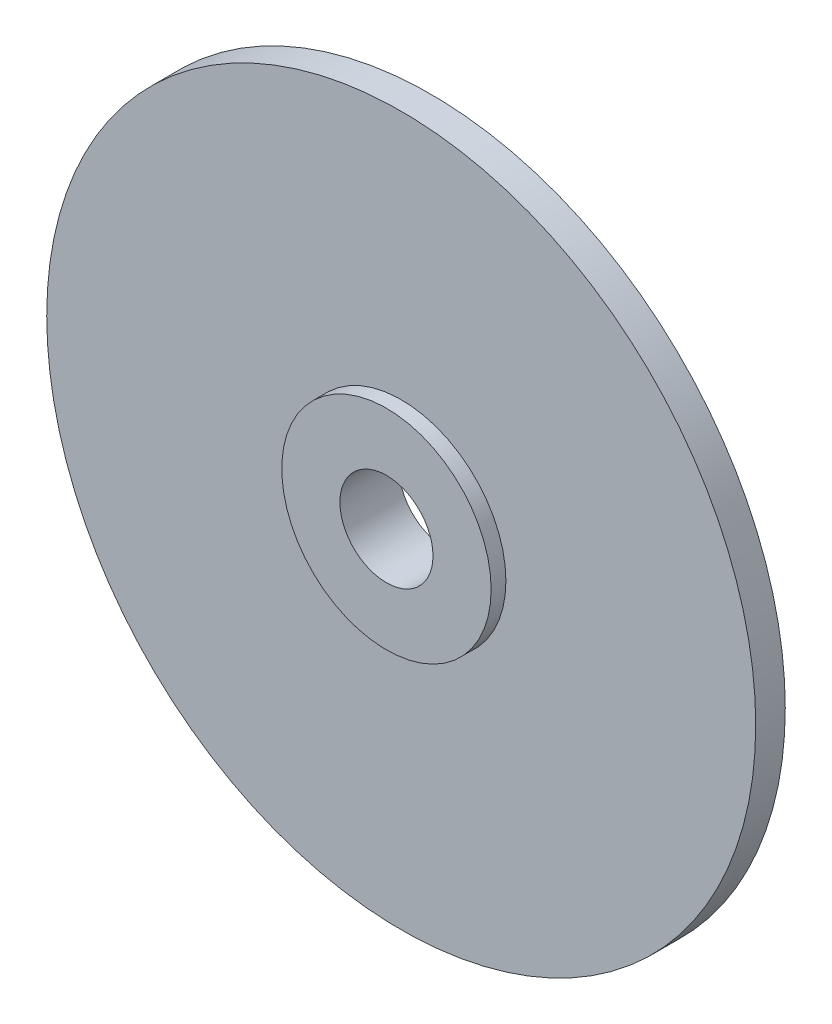
ISO-10303-21;
HEADER;
FILE_DESCRIPTION(('STEP AP214'),'2;1');
FILE_NAME('part.step','',(''),(''),'','','');
FILE_SCHEMA(('AUTOMOTIVE_DESIGN { 1 0 10303 214 1 1 1 1 }'));
ENDSEC;
DATA;
#1=APPLICATION_CONTEXT('core data for automotive mechanical design processes');
#2=APPLICATION_PROTOCOL_DEFINITION('international standard','automotive_design',2000,#1);
#3=PRODUCT_CONTEXT('',#1,'mechanical');
#4=PRODUCT('Part','Part','',(#3));
#5=PRODUCT_RELATED_PRODUCT_CATEGORY('part','',(#4));
#6=PRODUCT_DEFINITION_FORMATION('','',#4);
#7=PRODUCT_DEFINITION_CONTEXT('part definition',#1,'design');
#8=PRODUCT_DEFINITION('design','',#6,#7);
#9=PRODUCT_DEFINITION_SHAPE('','',#8);
#10=(LENGTH_UNIT() NAMED_UNIT(*) SI_UNIT(.MILLI.,.METRE.));
#11=(NAMED_UNIT(*) PLANE_ANGLE_UNIT() SI_UNIT($,.RADIAN.));
#12=(NAMED_UNIT(*) SI_UNIT($,.STERADIAN.) SOLID_ANGLE_UNIT());
#13=UNCERTAINTY_MEASURE_WITH_UNIT(LENGTH_MEASURE(1.E-05),#10,'distance_accuracy_value','');
#14=(GEOMETRIC_REPRESENTATION_CONTEXT(3) GLOBAL_UNCERTAINTY_ASSIGNED_CONTEXT((#13)) GLOBAL_UNIT_ASSIGNED_CONTEXT((#10,
#11,#12)) REPRESENTATION_CONTEXT('',''));
#15=CARTESIAN_POINT('',(0.,0.,0.));
#16=DIRECTION('',(0.,0.,1.));
#17=DIRECTION('',(1.,0.,0.));
#18=AXIS2_PLACEMENT_3D('',#15,#16,#17);
#19=CARTESIAN_POINT('',(0.,0.,0.));
#20=DIRECTION('',(0.,0.,1.));
#21=DIRECTION('',(1.,0.,0.));
#22=AXIS2_PLACEMENT_3D('',#19,#20,#21);
#23=PLANE('',#22);
#24=CARTESIAN_POINT('',(0.,0.,0.));
#25=DIRECTION('',(0.,0.,1.));
#26=DIRECTION('',(1.,0.,0.));
#27=AXIS2_PLACEMENT_3D('',#24,#25,#26);
#28=CIRCLE('',#27,152.4);
#29=CARTESIAN_POINT('',(152.4,0.,0.));
#30=VERTEX_POINT('',#29);
#31=EDGE_CURVE('E42',#30,#30,#28,.T.);
#32=ORIENTED_EDGE('',*,*,#31,.F.);
#33=EDGE_LOOP('',(#32));
#34=FACE_BOUND('',#33,.T.);
#35=CARTESIAN_POINT('',(0.,0.,0.));
#36=DIRECTION('',(0.,0.,1.));
#37=DIRECTION('',(1.,0.,0.));
#38=AXIS2_PLACEMENT_3D('',#35,#36,#37);
#39=CIRCLE('',#38,45.);
#40=CARTESIAN_POINT('',(45.,0.,0.));
#41=VERTEX_POINT('',#40);
#42=EDGE_CURVE('E10',#41,#41,#39,.F.);
#43=ORIENTED_EDGE('',*,*,#42,.F.);
#44=EDGE_LOOP('',(#43));
#45=FACE_BOUND('',#44,.T.);
#46=ADVANCED_FACE('F31',(#34,#45),#23,.F.);
#47=CARTESIAN_POINT('',(0.,0.,12.7));
#48=DIRECTION('',(0.,0.,1.));
#49=DIRECTION('',(1.,0.,0.));
#50=AXIS2_PLACEMENT_3D('',#47,#48,#49);
#51=PLANE('',#50);
#52=CARTESIAN_POINT('',(0.,0.,12.7));
#53=DIRECTION('',(0.,0.,1.));
#54=DIRECTION('',(1.,0.,0.));
#55=AXIS2_PLACEMENT_3D('',#52,#53,#54);
#56=CIRCLE('',#55,152.4);
#57=CARTESIAN_POINT('',(152.4,0.,12.7));
#58=VERTEX_POINT('',#57);
#59=EDGE_CURVE('E38',#58,#58,#56,.T.);
#60=ORIENTED_EDGE('',*,*,#59,.T.);
#61=EDGE_LOOP('',(#60));
#62=FACE_BOUND('',#61,.T.);
#63=CARTESIAN_POINT('',(0.,0.,12.7));
#64=DIRECTION('',(0.,0.,1.));
#65=DIRECTION('',(1.,0.,0.));
#66=AXIS2_PLACEMENT_3D('',#63,#64,#65);
#67=CIRCLE('',#66,45.);
#68=CARTESIAN_POINT('',(45.,0.,12.7));
#69=VERTEX_POINT('',#68);
#70=EDGE_CURVE('E49',#69,#69,#67,.T.);
#71=ORIENTED_EDGE('',*,*,#70,.F.);
#72=EDGE_LOOP('',(#71));
#73=FACE_BOUND('',#72,.T.);
#74=ADVANCED_FACE('F82',(#62,#73),#51,.T.);
#75=CARTESIAN_POINT('',(0.,0.,12.7));
#76=DIRECTION('',(0.,0.,-1.));
#77=DIRECTION('',(-1.,0.,0.));
#78=AXIS2_PLACEMENT_3D('',#75,#76,#77);
#79=CYLINDRICAL_SURFACE('',#78,152.4);
#80=ORIENTED_EDGE('',*,*,#59,.F.);
#81=EDGE_LOOP('',(#80));
#82=FACE_BOUND('',#81,.T.);
#83=ORIENTED_EDGE('',*,*,#31,.T.);
#84=EDGE_LOOP('',(#83));
#85=FACE_BOUND('',#84,.T.);
#86=ADVANCED_FACE('F33',(#82,#85),#79,.T.);
#87=CARTESIAN_POINT('',(0.,0.,12.7));
#88=DIRECTION('',(0.,0.,-1.));
#89=DIRECTION('',(-1.,0.,0.));
#90=AXIS2_PLACEMENT_3D('',#87,#88,#89);
#91=CYLINDRICAL_SURFACE('',#90,20.);
#92=CARTESIAN_POINT('',(0.,0.,19.05));
#93=DIRECTION('',(0.,0.,1.));
#94=DIRECTION('',(1.,0.,0.));
#95=AXIS2_PLACEMENT_3D('',#92,#93,#94);
#96=CIRCLE('',#95,20.);
#97=CARTESIAN_POINT('',(20.,0.,19.05));
#98=VERTEX_POINT('',#97);
#99=EDGE_CURVE('E52',#98,#98,#96,.T.);
#100=ORIENTED_EDGE('',*,*,#99,.T.);
#101=EDGE_LOOP('',(#100));
#102=FACE_BOUND('',#101,.T.);
#103=CARTESIAN_POINT('',(0.,0.,-6.35));
#104=DIRECTION('',(0.,0.,-1.));
#105=DIRECTION('',(-1.,0.,0.));
#106=AXIS2_PLACEMENT_3D('',#103,#104,#105);
#107=CIRCLE('',#106,20.);
#108=CARTESIAN_POINT('',(-20.,0.,-6.35));
#109=VERTEX_POINT('',#108);
#110=EDGE_CURVE('E60',#109,#109,#107,.T.);
#111=ORIENTED_EDGE('',*,*,#110,.T.);
#112=EDGE_LOOP('',(#111));
#113=FACE_BOUND('',#112,.T.);
#114=ADVANCED_FACE('F64',(#102,#113),#91,.F.);
#115=CARTESIAN_POINT('',(0.,0.,19.05));
#116=DIRECTION('',(0.,0.,1.));
#117=DIRECTION('',(1.,0.,0.));
#118=AXIS2_PLACEMENT_3D('',#115,#116,#117);
#119=PLANE('',#118);
#120=CARTESIAN_POINT('',(0.,0.,19.05));
#121=DIRECTION('',(0.,0.,1.));
#122=DIRECTION('',(1.,0.,0.));
#123=AXIS2_PLACEMENT_3D('',#120,#121,#122);
#124=CIRCLE('',#123,45.);
#125=CARTESIAN_POINT('',(45.,0.,19.05));
#126=VERTEX_POINT('',#125);
#127=EDGE_CURVE('E47',#126,#126,#124,.T.);
#128=ORIENTED_EDGE('',*,*,#127,.T.);
#129=EDGE_LOOP('',(#128));
#130=FACE_BOUND('',#129,.T.);
#131=ORIENTED_EDGE('',*,*,#99,.F.);
#132=EDGE_LOOP('',(#131));
#133=FACE_BOUND('',#132,.T.);
#134=ADVANCED_FACE('F78',(#130,#133),#119,.T.);
#135=CARTESIAN_POINT('',(0.,0.,19.05));
#136=DIRECTION('',(0.,0.,-1.));
#137=DIRECTION('',(-1.,0.,0.));
#138=AXIS2_PLACEMENT_3D('',#135,#136,#137);
#139=CYLINDRICAL_SURFACE('',#138,45.);
#140=ORIENTED_EDGE('',*,*,#127,.F.);
#141=EDGE_LOOP('',(#140));
#142=FACE_BOUND('',#141,.T.);
#143=ORIENTED_EDGE('',*,*,#70,.T.);
#144=EDGE_LOOP('',(#143));
#145=FACE_BOUND('',#144,.T.);
#146=ADVANCED_FACE('F69',(#142,#145),#139,.T.);
#147=CARTESIAN_POINT('',(0.,0.,-6.35));
#148=DIRECTION('',(0.,0.,-1.));
#149=DIRECTION('',(-1.,0.,0.));
#150=AXIS2_PLACEMENT_3D('',#147,#148,#149);
#151=PLANE('',#150);
#152=CARTESIAN_POINT('',(0.,0.,-6.35));
#153=DIRECTION('',(0.,0.,-1.));
#154=DIRECTION('',(-1.,0.,0.));
#155=AXIS2_PLACEMENT_3D('',#152,#153,#154);
#156=CIRCLE('',#155,45.);
#157=CARTESIAN_POINT('',(-45.,0.,-6.35));
#158=VERTEX_POINT('',#157);
#159=EDGE_CURVE('E57',#158,#158,#156,.T.);
#160=ORIENTED_EDGE('',*,*,#159,.T.);
#161=EDGE_LOOP('',(#160));
#162=FACE_BOUND('',#161,.T.);
#163=ORIENTED_EDGE('',*,*,#110,.F.);
#164=EDGE_LOOP('',(#163));
#165=FACE_BOUND('',#164,.T.);
#166=ADVANCED_FACE('F66',(#162,#165),#151,.T.);
#167=CARTESIAN_POINT('',(0.,0.,-6.35));
#168=DIRECTION('',(0.,0.,1.));
#169=DIRECTION('',(1.,0.,0.));
#170=AXIS2_PLACEMENT_3D('',#167,#168,#169);
#171=CYLINDRICAL_SURFACE('',#170,45.);
#172=ORIENTED_EDGE('',*,*,#159,.F.);
#173=EDGE_LOOP('',(#172));
#174=FACE_BOUND('',#173,.T.);
#175=ORIENTED_EDGE('',*,*,#42,.T.);
#176=EDGE_LOOP('',(#175));
#177=FACE_BOUND('',#176,.T.);
#178=ADVANCED_FACE('F68',(#174,#177),#171,.T.);
#179=CLOSED_SHELL('',(#46,#74,#86,#114,#134,#146,#166,#178));
#180=MANIFOLD_SOLID_BREP('B2',#179);
#181=ADVANCED_BREP_SHAPE_REPRESENTATION('',(#18,#180),#14);
#182=SHAPE_DEFINITION_REPRESENTATION(#9,#181);
ENDSEC;
END-ISO-10303-21;
